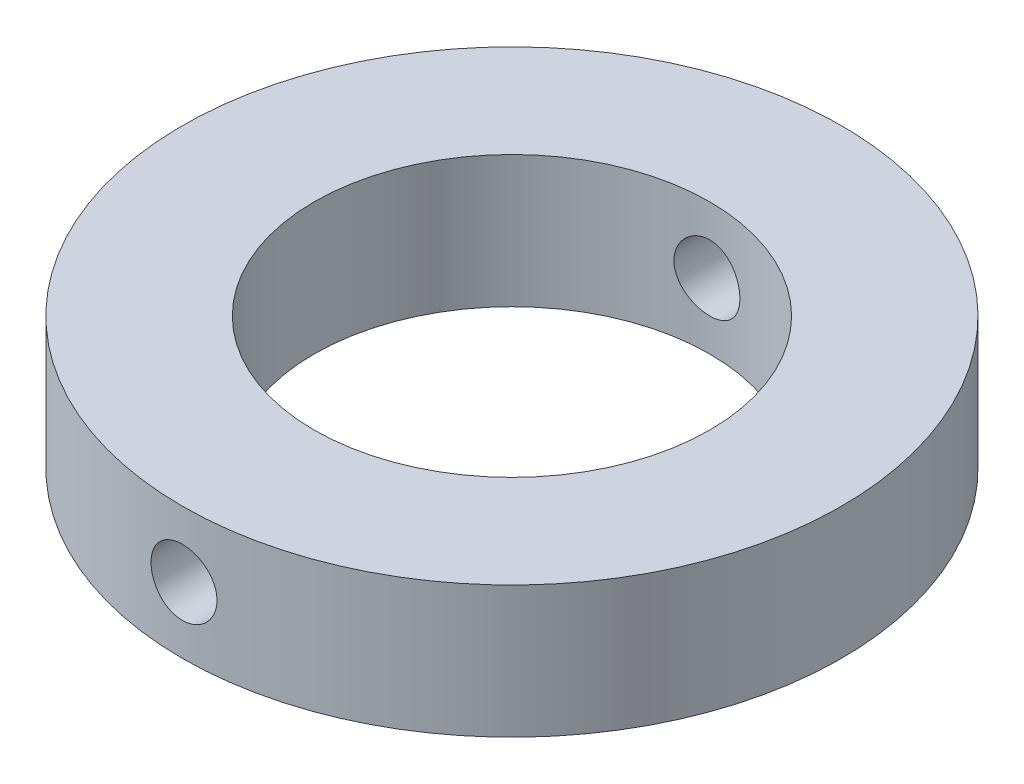
ISO-10303-21;
HEADER;
FILE_DESCRIPTION(('STEP AP214'),'2;1');
FILE_NAME('part.step','',(''),(''),'','','');
FILE_SCHEMA(('AUTOMOTIVE_DESIGN { 1 0 10303 214 1 1 1 1 }'));
ENDSEC;
DATA;
#1=APPLICATION_CONTEXT('core data for automotive mechanical design processes');
#2=APPLICATION_PROTOCOL_DEFINITION('international standard','automotive_design',2000,#1);
#3=PRODUCT_CONTEXT('',#1,'mechanical');
#4=PRODUCT('Part','Part','',(#3));
#5=PRODUCT_RELATED_PRODUCT_CATEGORY('part','',(#4));
#6=PRODUCT_DEFINITION_FORMATION('','',#4);
#7=PRODUCT_DEFINITION_CONTEXT('part definition',#1,'design');
#8=PRODUCT_DEFINITION('design','',#6,#7);
#9=PRODUCT_DEFINITION_SHAPE('','',#8);
#10=(LENGTH_UNIT() NAMED_UNIT(*) SI_UNIT(.MILLI.,.METRE.));
#11=(NAMED_UNIT(*) PLANE_ANGLE_UNIT() SI_UNIT($,.RADIAN.));
#12=(NAMED_UNIT(*) SI_UNIT($,.STERADIAN.) SOLID_ANGLE_UNIT());
#13=UNCERTAINTY_MEASURE_WITH_UNIT(LENGTH_MEASURE(1.E-05),#10,'distance_accuracy_value','');
#14=(GEOMETRIC_REPRESENTATION_CONTEXT(3) GLOBAL_UNCERTAINTY_ASSIGNED_CONTEXT((#13)) GLOBAL_UNIT_ASSIGNED_CONTEXT((#10,
#11,#12)) REPRESENTATION_CONTEXT('',''));
#15=CARTESIAN_POINT('',(0.,0.,0.));
#16=DIRECTION('',(0.,0.,1.));
#17=DIRECTION('',(1.,0.,0.));
#18=AXIS2_PLACEMENT_3D('',#15,#16,#17);
#19=CARTESIAN_POINT('',(0.,10.,0.));
#20=DIRECTION('',(0.,1.,0.));
#21=DIRECTION('',(0.,0.,1.));
#22=AXIS2_PLACEMENT_3D('',#19,#20,#21);
#23=PLANE('',#22);
#24=CARTESIAN_POINT('',(0.,10.,0.));
#25=DIRECTION('',(0.,1.,0.));
#26=DIRECTION('',(0.,0.,1.));
#27=AXIS2_PLACEMENT_3D('',#24,#25,#26);
#28=CIRCLE('',#27,25.);
#29=CARTESIAN_POINT('',(0.,10.,25.));
#30=VERTEX_POINT('',#29);
#31=EDGE_CURVE('E11',#30,#30,#28,.T.);
#32=ORIENTED_EDGE('',*,*,#31,.T.);
#33=EDGE_LOOP('',(#32));
#34=FACE_BOUND('',#33,.T.);
#35=CARTESIAN_POINT('',(0.,10.,0.));
#36=DIRECTION('',(0.,1.,0.));
#37=DIRECTION('',(0.,0.,1.));
#38=AXIS2_PLACEMENT_3D('',#35,#36,#37);
#39=CIRCLE('',#38,15.);
#40=CARTESIAN_POINT('',(0.,10.,15.));
#41=VERTEX_POINT('',#40);
#42=EDGE_CURVE('E60',#41,#41,#39,.T.);
#43=ORIENTED_EDGE('',*,*,#42,.F.);
#44=EDGE_LOOP('',(#43));
#45=FACE_BOUND('',#44,.T.);
#46=ADVANCED_FACE('F41',(#34,#45),#23,.T.);
#47=CARTESIAN_POINT('',(0.,0.,0.));
#48=DIRECTION('',(0.,1.,0.));
#49=DIRECTION('',(0.,0.,1.));
#50=AXIS2_PLACEMENT_3D('',#47,#48,#49);
#51=PLANE('',#50);
#52=CARTESIAN_POINT('',(0.,0.,0.));
#53=DIRECTION('',(0.,1.,0.));
#54=DIRECTION('',(0.,0.,1.));
#55=AXIS2_PLACEMENT_3D('',#52,#53,#54);
#56=CIRCLE('',#55,25.);
#57=CARTESIAN_POINT('',(0.,0.,25.));
#58=VERTEX_POINT('',#57);
#59=EDGE_CURVE('E55',#58,#58,#56,.T.);
#60=ORIENTED_EDGE('',*,*,#59,.F.);
#61=EDGE_LOOP('',(#60));
#62=FACE_BOUND('',#61,.T.);
#63=CARTESIAN_POINT('',(0.,0.,0.));
#64=DIRECTION('',(0.,1.,0.));
#65=DIRECTION('',(0.,0.,1.));
#66=AXIS2_PLACEMENT_3D('',#63,#64,#65);
#67=CIRCLE('',#66,15.);
#68=CARTESIAN_POINT('',(0.,0.,15.));
#69=VERTEX_POINT('',#68);
#70=EDGE_CURVE('E63',#69,#69,#67,.T.);
#71=ORIENTED_EDGE('',*,*,#70,.T.);
#72=EDGE_LOOP('',(#71));
#73=FACE_BOUND('',#72,.T.);
#74=ADVANCED_FACE('F99',(#62,#73),#51,.F.);
#75=CARTESIAN_POINT('',(0.,10.,0.));
#76=DIRECTION('',(0.,-1.,0.));
#77=DIRECTION('',(0.,0.,-1.));
#78=AXIS2_PLACEMENT_3D('',#75,#76,#77);
#79=CYLINDRICAL_SURFACE('',#78,25.);
#80=CARTESIAN_POINT('',(0.,7.5,-25.));
#81=CARTESIAN_POINT('',(-0.140050884478893,7.49999393524905,-24.9999983880192));
#82=CARTESIAN_POINT('',(-0.280194362919433,7.48819182775889,-24.9988106399051));
#83=CARTESIAN_POINT('',(-0.556595996242092,7.44128907427394,-24.9941866898684));
#84=CARTESIAN_POINT('',(-0.69284969792207,7.40616275993853,-24.9907480108506));
#85=CARTESIAN_POINT('',(-0.957429188633536,7.31364439850542,-24.9820103640768));
#86=CARTESIAN_POINT('',(-1.08575971153727,7.25626579870382,-24.9767125200177));
#87=CARTESIAN_POINT('',(-1.33094040240102,7.12089773017089,-24.9648489348577));
#88=CARTESIAN_POINT('',(-1.44779284694769,7.04291235999966,-24.9582834459533));
#89=CARTESIAN_POINT('',(-1.6671488766852,6.86824325584432,-24.9445936085331));
#90=CARTESIAN_POINT('',(-1.76960536208723,6.77150050149492,-24.9374675393466));
#91=CARTESIAN_POINT('',(-1.95685630357746,6.56218866434243,-24.9234739226566));
#92=CARTESIAN_POINT('',(-2.04164994270663,6.44961884989404,-24.9166063871229));
#93=CARTESIAN_POINT('',(-2.19133492610904,6.21155367079095,-24.9038897888196));
#94=CARTESIAN_POINT('',(-2.2561836636372,6.08603138976286,-24.8980429177726));
#95=CARTESIAN_POINT('',(-2.3638659618569,5.82581103523755,-24.8880509386631));
#96=CARTESIAN_POINT('',(-2.40670006647823,5.69111318854013,-24.8839057885556));
#97=CARTESIAN_POINT('',(-2.46899760400473,5.41684549783498,-24.8778021018244));
#98=CARTESIAN_POINT('',(-2.48853913250949,5.27729355786948,-24.8758362599524));
#99=CARTESIAN_POINT('',(-2.5039382128384,4.99687784151055,-24.8742910765131));
#100=CARTESIAN_POINT('',(-2.499796387177,4.85601409969485,-24.8747116722186));
#101=CARTESIAN_POINT('',(-2.4680107006317,4.57751172576671,-24.8778851724734));
#102=CARTESIAN_POINT('',(-2.44045211031138,4.43986325167827,-24.8806296147663));
#103=CARTESIAN_POINT('',(-2.36274786037646,4.17115509199727,-24.8881283571855));
#104=CARTESIAN_POINT('',(-2.31260189563937,4.04009549543742,-24.8928826844623));
#105=CARTESIAN_POINT('',(-2.19105223470377,3.78801603175278,-24.9038752363018));
#106=CARTESIAN_POINT('',(-2.11961070679995,3.66701452627671,-24.9101160977039));
#107=CARTESIAN_POINT('',(-1.95752506838307,3.4386869627203,-24.923376293322));
#108=CARTESIAN_POINT('',(-1.86688039584126,3.33136130504559,-24.9303956503196));
#109=CARTESIAN_POINT('',(-1.66848528103017,3.13293651502744,-24.9444596328247));
#110=CARTESIAN_POINT('',(-1.56066119712841,3.04191099529799,-24.9515042333249));
#111=CARTESIAN_POINT('',(-1.33122370434278,2.87924091772403,-24.964795726963));
#112=CARTESIAN_POINT('',(-1.209610279999,2.80759638160881,-24.9710426192064));
#113=CARTESIAN_POINT('',(-0.955995264230911,2.68572494922437,-24.9820368916774));
#114=CARTESIAN_POINT('',(-0.823991865974757,2.63550178795485,-24.9867840103692));
#115=CARTESIAN_POINT('',(-0.553368043324829,2.55795270822062,-24.9942411860352));
#116=CARTESIAN_POINT('',(-0.4147478169415,2.53062610502345,-24.9969513039266));
#117=CARTESIAN_POINT('',(-0.135462747729758,2.49973923066309,-25.0000212917078));
#118=CARTESIAN_POINT('',(0.00519075526373111,2.49607737936876,-25.0003912066934));
#119=CARTESIAN_POINT('',(0.28510948328925,2.51235715762191,-24.9987660439199));
#120=CARTESIAN_POINT('',(0.424374727051176,2.5322984682882,-24.9967709981117));
#121=CARTESIAN_POINT('',(0.697270517086688,2.59513423855394,-24.9906465384799));
#122=CARTESIAN_POINT('',(0.83091212243005,2.63798113619503,-24.986521547951));
#123=CARTESIAN_POINT('',(1.08911080345946,2.74536293509318,-24.9765999715152));
#124=CARTESIAN_POINT('',(1.21366767539279,2.8098983225985,-24.9708033481313));
#125=CARTESIAN_POINT('',(1.45062045043036,2.95907709665979,-24.9581618832606));
#126=CARTESIAN_POINT('',(1.56297414937229,3.04378722231455,-24.951313590086));
#127=CARTESIAN_POINT('',(1.7719040582797,3.23081516935232,-24.937348321738));
#128=CARTESIAN_POINT('',(1.86847987212294,3.3331334326758,-24.9302313398243));
#129=CARTESIAN_POINT('',(2.04346527471786,3.55291643664751,-24.9165006035189));
#130=CARTESIAN_POINT('',(2.12180819669886,3.67043439135656,-24.9098887534744));
#131=CARTESIAN_POINT('',(2.25764564685957,3.91701840036672,-24.8979458115222));
#132=CARTESIAN_POINT('',(2.31514046013471,4.04608429672099,-24.8926147021009));
#133=CARTESIAN_POINT('',(2.40753802171119,4.31187184866449,-24.8838486908512));
#134=CARTESIAN_POINT('',(2.44248043702965,4.44857960022781,-24.8804104612447));
#135=CARTESIAN_POINT('',(2.48891001782366,4.72595799490193,-24.8758091320719));
#136=CARTESIAN_POINT('',(2.50039785599879,4.86662852423919,-24.8746459672547));
#137=CARTESIAN_POINT('',(2.49958284617814,5.14727672089177,-24.8747278276891));
#138=CARTESIAN_POINT('',(2.48738472398278,5.28725470720704,-24.8759622521752));
#139=CARTESIAN_POINT('',(2.43976363240913,5.56316229292072,-24.8806775972386));
#140=CARTESIAN_POINT('',(2.4043406369054,5.69909188776495,-24.884158520343));
#141=CARTESIAN_POINT('',(2.31130421574376,5.96304337261965,-24.8929717065797));
#142=CARTESIAN_POINT('',(2.25369386085229,6.09106635407432,-24.898303713509));
#143=CARTESIAN_POINT('',(2.11792888727761,6.33564222917759,-24.910218795984));
#144=CARTESIAN_POINT('',(2.03977438363854,6.45219518705158,-24.9168018645238));
#145=CARTESIAN_POINT('',(1.86474639071333,6.67105918617984,-24.9305121802424));
#146=CARTESIAN_POINT('',(1.76779487222567,6.77330769091772,-24.9376416181688));
#147=CARTESIAN_POINT('',(1.55807924806277,6.96013058174915,-24.9516213682196));
#148=CARTESIAN_POINT('',(1.44531136027064,7.04470072839293,-24.9584716130744));
#149=CARTESIAN_POINT('',(1.20685358540322,7.19393363463656,-24.971139051729));
#150=CARTESIAN_POINT('',(1.08113187336691,7.25854572736296,-24.9769536006703));
#151=CARTESIAN_POINT('',(0.820645697751377,7.36565605705967,-24.9868657312474));
#152=CARTESIAN_POINT('',(0.685891624564024,7.40817922738387,-24.9909652477413));
#153=CARTESIAN_POINT('',(0.458645653514261,7.45930154271201,-24.9959553443433));
#154=CARTESIAN_POINT('',(0.367606382111273,7.4745426107484,-24.9974650172958));
#155=CARTESIAN_POINT('',(0.184391452043283,7.49489381515441,-24.9994878737697));
#156=CARTESIAN_POINT('',(0.0922157980663949,7.50000399330466,-25.0000010614006));
#157=CARTESIAN_POINT('',(0.,7.5,-25.));
#158=B_SPLINE_CURVE_WITH_KNOTS('',3,(#80,#81,#82,#83,#84,#85,#86,#87,#88,#89,#90,#91,#92,#93,
#94,#95,#96,#97,#98,#99,#100,#101,#102,#103,#104,#105,#106,#107,#108,#109,#110,#111,#112,#113,
#114,#115,#116,#117,#118,#119,#120,#121,#122,#123,#124,#125,#126,#127,#128,#129,#130,#131,#132,
#133,#134,#135,#136,#137,#138,#139,#140,#141,#142,#143,#144,#145,#146,#147,#148,#149,#150,#151,
#152,#153,#154,#155,#156,#157),.UNSPECIFIED.,.T.,.F.,(4,2,2,2,2,2,2,2,2,2,2,2,2,2,2,2,2,2,2,2,2,
2,2,2,2,2,2,2,2,2,2,2,2,2,2,2,2,2,4),(0.,0.419815915671184,0.840094607088716,1.26011971433051,
1.68006134395696,2.10134642155736,2.52265098051765,2.94484938680555,3.3670373610626,
3.78780580112992,4.20856318139441,4.62779493602776,5.04703235404084,5.46701903432237,
5.88701800827813,6.30886835490516,6.73071917449429,7.15264351733954,7.57455524188599,
7.99465471519394,8.41474851297859,8.83397338235762,9.25320765123667,9.67384851871746,
10.0944999452558,10.516666090215,10.9388264618844,11.3602422648251,11.7816459809896,
12.2011907323489,12.620735955651,13.04022313407,13.459707963474,13.8809729356913,
14.3023388159239,14.7247657756561,15.1467148698824,15.4231416808087,15.6995673517257),.UNSPECIFIED.);
#159=CARTESIAN_POINT('',(0.,7.5,-25.));
#160=VERTEX_POINT('',#159);
#161=EDGE_CURVE('E88',#160,#160,#158,.T.);
#162=ORIENTED_EDGE('',*,*,#161,.T.);
#163=EDGE_LOOP('',(#162));
#164=FACE_BOUND('',#163,.T.);
#165=CARTESIAN_POINT('',(2.5,5.,24.8746859276655));
#166=CARTESIAN_POINT('',(2.49999393348378,4.859951089566,24.8746875699226));
#167=CARTESIAN_POINT('',(2.48819214745619,4.7198095789704,24.8758814248555));
#168=CARTESIAN_POINT('',(2.44129078690891,4.44341203426616,24.880527188953));
#169=CARTESIAN_POINT('',(2.40616553721609,4.30716045490628,24.8839815865305));
#170=CARTESIAN_POINT('',(2.31365029017232,4.04258545195524,24.8927533261847));
#171=CARTESIAN_POINT('',(2.25627379073475,3.9142572765214,24.8980695386697));
#172=CARTESIAN_POINT('',(2.12091066847775,3.66908051927063,24.9099645142955));
#173=CARTESIAN_POINT('',(2.04292813906481,3.55222966379071,24.9165430266082));
#174=CARTESIAN_POINT('',(1.86826190499676,3.33287184085626,24.9302481677475));
#175=CARTESIAN_POINT('',(1.77151854527065,3.23041247624055,24.9373765001317));
#176=CARTESIAN_POINT('',(1.56220428829891,3.04315597749108,24.951362630893));
#177=CARTESIAN_POINT('',(1.44963266726642,2.95835965148423,24.9582204168803));
#178=CARTESIAN_POINT('',(1.21156590412747,2.80867185748212,24.9709095788901));
#179=CARTESIAN_POINT('',(1.08604415632392,2.74382250301584,24.9767387723662));
#180=CARTESIAN_POINT('',(0.825824960718776,2.6361389171283,24.9866954218943));
#181=CARTESIAN_POINT('',(0.691127736670547,2.59330414907633,24.9908229194266));
#182=CARTESIAN_POINT('',(0.416861956857374,2.53100522661688,24.9968991642756));
#183=CARTESIAN_POINT('',(0.277311317578954,2.51146291812514,24.9988551960704));
#184=CARTESIAN_POINT('',(-0.0031018517223572,2.49606182716571,25.0003928899673));
#185=CARTESIAN_POINT('',(-0.143964347636153,2.50020243063432,24.9999746136318));
#186=CARTESIAN_POINT('',(-0.4224721101614,2.53198618162539,24.9968167827796));
#187=CARTESIAN_POINT('',(-0.560127074837447,2.55954528890973,24.9940855287928));
#188=CARTESIAN_POINT('',(-0.828847948761332,2.63725282236656,24.9866182316233));
#189=CARTESIAN_POINT('',(-0.959913772394321,2.68740154196893,24.9818821623988));
#190=CARTESIAN_POINT('',(-1.21200078669897,2.8089569081361,24.9709234370979));
#191=CARTESIAN_POINT('',(-1.33300392745412,2.8804007438254,24.9646981841439));
#192=CARTESIAN_POINT('',(-1.56133378293548,3.04249130834093,24.9514596129852));
#193=CARTESIAN_POINT('',(-1.66866009640207,3.13313860036296,24.9444462716703));
#194=CARTESIAN_POINT('',(-1.86708192955672,3.33153557378412,24.9303823366963));
#195=CARTESIAN_POINT('',(-1.95810436547586,3.43935836185394,24.9233317143257));
#196=CARTESIAN_POINT('',(-2.12076883839479,3.66879216302695,24.9100184982056));
#197=CARTESIAN_POINT('',(-2.19241084728222,3.79040319613036,24.9037559055991));
#198=CARTESIAN_POINT('',(-2.31428046143307,4.04401756299948,24.8927272378537));
#199=CARTESIAN_POINT('',(-2.3645035514324,4.17602308105722,24.8879614783139));
#200=CARTESIAN_POINT('',(-2.44205183909397,4.44665151153673,24.8804725467734));
#201=CARTESIAN_POINT('',(-2.46937773435758,4.58527422221861,24.8777493125442));
#202=CARTESIAN_POINT('',(-2.5002619384799,4.86456044882377,24.8746645131854));
#203=CARTESIAN_POINT('',(-2.50392249161803,5.00521255066209,24.8742927886901));
#204=CARTESIAN_POINT('',(-2.48764061717841,5.28512816455716,24.8759262838693));
#205=CARTESIAN_POINT('',(-2.46769850852438,5.42439169535092,24.8779314714265));
#206=CARTESIAN_POINT('',(-2.4048629362688,5.69727895569586,24.88408361056));
#207=CARTESIAN_POINT('',(-2.36201781797227,5.83091392773665,24.8882260500336));
#208=CARTESIAN_POINT('',(-2.25464179918985,6.08910012932577,24.8981822759699));
#209=CARTESIAN_POINT('',(-2.19011040195897,6.21365115071796,24.9039961007167));
#210=CARTESIAN_POINT('',(-2.04093750355804,6.45059993507194,24.9166646088928));
#211=CARTESIAN_POINT('',(-1.95622824960173,6.56295485491564,24.9235227703668));
#212=CARTESIAN_POINT('',(-1.76920133362793,6.77188763318517,24.9374958156297));
#213=CARTESIAN_POINT('',(-1.66688323562034,6.8684651008502,24.9446107057716));
#214=CARTESIAN_POINT('',(-1.44709951056618,7.04345408349524,24.9583261962325));
#215=CARTESIAN_POINT('',(-1.32958063992363,7.12179889896555,24.9649248513869));
#216=CARTESIAN_POINT('',(-1.08299429354283,7.25763967126603,24.9768360526658));
#217=CARTESIAN_POINT('',(-0.953926976074063,7.31513591376777,24.9821486164123));
#218=CARTESIAN_POINT('',(-0.688140316082037,7.40753441913834,24.9908802603501));
#219=CARTESIAN_POINT('',(-0.551435094124898,7.44247696831304,24.9943027151412));
#220=CARTESIAN_POINT('',(-0.274062034959197,7.48890767394961,24.9988823653412));
#221=CARTESIAN_POINT('',(-0.133394309230543,7.5003964895851,25.0000396244141));
#222=CARTESIAN_POINT('',(0.147255560189367,7.49958433390015,24.9999584578317));
#223=CARTESIAN_POINT('',(0.287238018061321,7.48738690790836,24.9987304594167));
#224=CARTESIAN_POINT('',(0.563154720890908,7.43976563585756,24.9940373394398));
#225=CARTESIAN_POINT('',(0.699088962670915,7.40434177156758,24.9905722161218));
#226=CARTESIAN_POINT('',(0.963049771919359,7.31130185651767,24.981793095349));
#227=CARTESIAN_POINT('',(1.09107741519382,7.25368883266461,24.9764793500812));
#228=CARTESIAN_POINT('',(1.33566150038699,7.11791707770756,24.9645953104074));
#229=CARTESIAN_POINT('',(1.4522180094214,7.03975846682221,24.9580250233539));
#230=CARTESIAN_POINT('',(1.67108181106735,6.86472595244063,24.9443296167264));
#231=CARTESIAN_POINT('',(1.77332731554835,6.767774959388,24.9372022865175));
#232=CARTESIAN_POINT('',(1.96014439848286,6.55806162113638,24.9232147692415));
#233=CARTESIAN_POINT('',(2.04471172961962,6.44529548707731,24.9163546466944));
#234=CARTESIAN_POINT('',(2.19394160106013,6.20683914520023,24.903659585265));
#235=CARTESIAN_POINT('',(2.25855296998709,6.08111679668987,24.8978272981327));
#236=CARTESIAN_POINT('',(2.36566177024692,5.82062927188442,24.8878798690615));
#237=CARTESIAN_POINT('',(2.40818414472465,5.68587449018572,24.883762791334));
#238=CARTESIAN_POINT('',(2.45930422083382,5.45863064775222,24.8787501884536));
#239=CARTESIAN_POINT('',(2.47454428099556,5.36759437173393,24.8772332983924));
#240=CARTESIAN_POINT('',(2.49489414651278,5.18438544239362,24.8752006294416));
#241=CARTESIAN_POINT('',(2.50000399439316,5.09221279384352,24.8746848463496));
#242=CARTESIAN_POINT('',(2.5,5.,24.8746859276655));
#243=B_SPLINE_CURVE_WITH_KNOTS('',3,(#165,#166,#167,#168,#169,#170,#171,#172,#173,#174,#175,
#176,#177,#178,#179,#180,#181,#182,#183,#184,#185,#186,#187,#188,#189,#190,#191,#192,#193,#194,
#195,#196,#197,#198,#199,#200,#201,#202,#203,#204,#205,#206,#207,#208,#209,#210,#211,#212,#213,
#214,#215,#216,#217,#218,#219,#220,#221,#222,#223,#224,#225,#226,#227,#228,#229,#230,#231,#232,
#233,#234,#235,#236,#237,#238,#239,#240,#241,#242),.UNSPECIFIED.,.T.,.F.,(4,2,2,2,2,2,2,2,2,2,2,
2,2,2,2,2,2,2,2,2,2,2,2,2,2,2,2,2,2,2,2,2,2,2,2,2,2,2,4),(0.,0.419809986091155,
0.840082879554424,1.26010122749369,1.68003620105329,2.10132903824813,2.52264114638132,
2.94483674928229,3.36702206019487,3.78778677246124,4.20854057495581,4.62779079546654,
5.04704646202436,5.46703863666033,5.88704313046322,6.30888562712503,6.73072873568907,
7.15266072794834,7.57457986487582,7.99467490769413,8.41476427417175,8.83397036761317,
9.25318606402618,9.67382974529295,10.0944838430801,10.516653420453,10.9388172129501,
11.360224817359,11.7816205778287,12.2011783367121,12.6207364249165,13.0402372998812,
13.45973572027,13.8809928759497,14.3023511258631,14.7247810267619,15.14673287235,
15.4231506901512,15.6995673475954),.UNSPECIFIED.);
#244=CARTESIAN_POINT('',(2.5,5.,24.8746859276655));
#245=VERTEX_POINT('',#244);
#246=EDGE_CURVE('E83',#245,#245,#243,.T.);
#247=ORIENTED_EDGE('',*,*,#246,.T.);
#248=EDGE_LOOP('',(#247));
#249=FACE_BOUND('',#248,.T.);
#250=ORIENTED_EDGE('',*,*,#31,.F.);
#251=EDGE_LOOP('',(#250));
#252=FACE_BOUND('',#251,.T.);
#253=ORIENTED_EDGE('',*,*,#59,.T.);
#254=EDGE_LOOP('',(#253));
#255=FACE_BOUND('',#254,.T.);
#256=ADVANCED_FACE('F43',(#164,#249,#252,#255),#79,.T.);
#257=CARTESIAN_POINT('',(0.,10.,0.));
#258=DIRECTION('',(0.,-1.,0.));
#259=DIRECTION('',(0.,0.,-1.));
#260=AXIS2_PLACEMENT_3D('',#257,#258,#259);
#261=CYLINDRICAL_SURFACE('',#260,15.);
#262=CARTESIAN_POINT('',(0.,7.5,-15.));
#263=CARTESIAN_POINT('',(-0.139390904958215,7.49999441105219,-14.9999976116882));
#264=CARTESIAN_POINT('',(-0.278857881838821,7.48830272503108,-14.9980367791303));
#265=CARTESIAN_POINT('',(-0.553880221673043,7.44186434123468,-14.9904034494139));
#266=CARTESIAN_POINT('',(-0.689431867959247,7.4070964430884,-14.9847275392389));
#267=CARTESIAN_POINT('',(-0.952604747212644,7.31558455140725,-14.9703006823645));
#268=CARTESIAN_POINT('',(-1.0802323684319,7.25885853435943,-14.9615522515919));
#269=CARTESIAN_POINT('',(-1.32414184197794,7.12508770794761,-14.9419422708207));
#270=CARTESIAN_POINT('',(-1.44042498987859,7.04804522251701,-14.9310809625443));
#271=CARTESIAN_POINT('',(-1.65947261429168,6.87504491617954,-14.9083331745831));
#272=CARTESIAN_POINT('',(-1.76211290353497,6.77893088536387,-14.8964387181486));
#273=CARTESIAN_POINT('',(-1.94988849865993,6.57085203152719,-14.8730262687673));
#274=CARTESIAN_POINT('',(-2.03502269939097,6.45888620854339,-14.8615082996267));
#275=CARTESIAN_POINT('',(-2.18586712560513,6.22142903380295,-14.8400756575978));
#276=CARTESIAN_POINT('',(-2.251454552861,6.09585866319525,-14.8301712909164));
#277=CARTESIAN_POINT('',(-2.36055836541122,5.83529043569938,-14.8131978979467));
#278=CARTESIAN_POINT('',(-2.40407624156561,5.70029321632237,-14.8061286801431));
#279=CARTESIAN_POINT('',(-2.46741437778481,5.42601972514346,-14.7957053684276));
#280=CARTESIAN_POINT('',(-2.4874490291354,5.28679426349861,-14.792317684857));
#281=CARTESIAN_POINT('',(-2.50391672528988,5.00691972311653,-14.7895393893665));
#282=CARTESIAN_POINT('',(-2.500351440389,4.8662707458327,-14.7901484945721));
#283=CARTESIAN_POINT('',(-2.46989509839615,4.58907213872456,-14.7952642886356));
#284=CARTESIAN_POINT('',(-2.44324488188977,4.45249519645477,-14.7997307331892));
#285=CARTESIAN_POINT('',(-2.36775314040344,4.18577868217087,-14.8119949521101));
#286=CARTESIAN_POINT('',(-2.31891085431974,4.05563933111146,-14.8197928407327));
#287=CARTESIAN_POINT('',(-2.20017724609391,3.80477117655908,-14.837884793341));
#288=CARTESIAN_POINT('',(-2.13018591387971,3.68409059391878,-14.8481906710733));
#289=CARTESIAN_POINT('',(-1.97121201755743,3.45609559946162,-14.8701291841501));
#290=CARTESIAN_POINT('',(-1.88222792065429,3.34878226754507,-14.8817619265429));
#291=CARTESIAN_POINT('',(-1.68648221215905,3.14917391419266,-14.9052202787979));
#292=CARTESIAN_POINT('',(-1.57951396387313,3.05708148145992,-14.9170464923165));
#293=CARTESIAN_POINT('',(-1.35153524898165,2.89212223733466,-14.9394260139672));
#294=CARTESIAN_POINT('',(-1.23052469190642,2.81925554981678,-14.9499793138975));
#295=CARTESIAN_POINT('',(-0.977705916166709,2.69479777286372,-14.9686389289291));
#296=CARTESIAN_POINT('',(-0.845888725564659,2.64322458066875,-14.9767431840745));
#297=CARTESIAN_POINT('',(-0.575298345602729,2.56300578475402,-14.9895750301266));
#298=CARTESIAN_POINT('',(-0.436525739179466,2.53435826302629,-14.9943029035047));
#299=CARTESIAN_POINT('',(-0.157709901301622,2.50107864153887,-14.9998112984269));
#300=CARTESIAN_POINT('',(-0.0177007371510094,2.4961684281944,-15.0006375301278));
#301=CARTESIAN_POINT('',(0.261139772889889,2.50976134442813,-14.9983747442117));
#302=CARTESIAN_POINT('',(0.399971163892041,2.52826357313374,-14.9952858772412));
#303=CARTESIAN_POINT('',(0.671656175546766,2.58792484933548,-14.985568269382));
#304=CARTESIAN_POINT('',(0.804540868385381,2.62894620839013,-14.9789610480131));
#305=CARTESIAN_POINT('',(1.06154688486044,2.73233451819954,-14.9629446445536));
#306=CARTESIAN_POINT('',(1.18566771590972,2.79470266763528,-14.9535353051202));
#307=CARTESIAN_POINT('',(1.42283068946896,2.93965112469679,-14.9328451630241));
#308=CARTESIAN_POINT('',(1.53576525093715,3.02240515616726,-14.9215485588702));
#309=CARTESIAN_POINT('',(1.74624358550269,3.20553731538506,-14.898384673919));
#310=CARTESIAN_POINT('',(1.84378623969658,3.30591672327667,-14.8865173517155));
#311=CARTESIAN_POINT('',(2.021742779658,3.52269754807143,-14.8634017523585));
#312=CARTESIAN_POINT('',(2.10196876111372,3.63925416551441,-14.8521611613711));
#313=CARTESIAN_POINT('',(2.24170231029499,3.88435296913854,-14.8317152977788));
#314=CARTESIAN_POINT('',(2.30121053476982,4.0128947752275,-14.8225099606602));
#315=CARTESIAN_POINT('',(2.39753833147315,4.27778973281214,-14.807234536977));
#316=CARTESIAN_POINT('',(2.43445143254795,4.41410809503049,-14.8011515431106));
#317=CARTESIAN_POINT('',(2.48483545377828,4.69112012922177,-14.7927771683526));
#318=CARTESIAN_POINT('',(2.49830841194617,4.83181341973206,-14.7904854578272));
#319=CARTESIAN_POINT('',(2.50137286604735,5.11170516596241,-14.7899673308401));
#320=CARTESIAN_POINT('',(2.49126013612519,5.25090037857529,-14.7916905650565));
#321=CARTESIAN_POINT('',(2.44807983895685,5.52557924805077,-14.7988978145373));
#322=CARTESIAN_POINT('',(2.41501234611248,5.66106291694188,-14.8043818176121));
#323=CARTESIAN_POINT('',(2.3269744895949,5.92435843729262,-14.8184735628172));
#324=CARTESIAN_POINT('',(2.27202959060044,6.05217901005603,-14.8270776721967));
#325=CARTESIAN_POINT('',(2.14182700391591,6.29683566919485,-14.8464436892221));
#326=CARTESIAN_POINT('',(2.06656830874856,6.41367121037214,-14.857205703884));
#327=CARTESIAN_POINT('',(1.89681888437216,6.63453558310776,-14.8798345404562));
#328=CARTESIAN_POINT('',(1.80211056359365,6.73839601670028,-14.891712955763));
#329=CARTESIAN_POINT('',(1.59660903138023,6.92885160447494,-14.9151437236084));
#330=CARTESIAN_POINT('',(1.48581211291264,7.01544276863818,-14.9266960002655));
#331=CARTESIAN_POINT('',(1.25036916964028,7.16944826819995,-14.9482652964222));
#332=CARTESIAN_POINT('',(1.12563278753282,7.23672603931296,-14.958271162531));
#333=CARTESIAN_POINT('',(0.866513069378981,7.34926948460992,-14.9755116760178));
#334=CARTESIAN_POINT('',(0.73213949483001,7.3945570810797,-14.9827490817748));
#335=CARTESIAN_POINT('',(0.497703310045401,7.45200527412667,-14.9920579083296));
#336=CARTESIAN_POINT('',(0.399058830298447,7.46997446961597,-14.9950202727336));
#337=CARTESIAN_POINT('',(0.200289310319809,7.49397373784476,-14.9989921598612));
#338=CARTESIAN_POINT('',(0.100164295608494,7.50000401613737,-15.0000017162064));
#339=CARTESIAN_POINT('',(0.,7.5,-15.));
#340=B_SPLINE_CURVE_WITH_KNOTS('',3,(#262,#263,#264,#265,#266,#267,#268,#269,#270,#271,#272,
#273,#274,#275,#276,#277,#278,#279,#280,#281,#282,#283,#284,#285,#286,#287,#288,#289,#290,#291,
#292,#293,#294,#295,#296,#297,#298,#299,#300,#301,#302,#303,#304,#305,#306,#307,#308,#309,#310,
#311,#312,#313,#314,#315,#316,#317,#318,#319,#320,#321,#322,#323,#324,#325,#326,#327,#328,#329,
#330,#331,#332,#333,#334,#335,#336,#337,#338,#339),.UNSPECIFIED.,.T.,.F.,(4,2,2,2,2,2,2,2,2,2,2,
2,2,2,2,2,2,2,2,2,2,2,2,2,2,2,2,2,2,2,2,2,2,2,2,2,2,2,4),(0.,0.41780658493851,0.835997545695421,
1.25384686702527,1.67164841267479,2.09302491062332,2.51442800169857,2.9384252082384,
3.36239376876181,3.78246077103424,4.20249804320887,4.61820521760409,5.03392665025381,
5.45164556632558,5.86939820680574,6.29232769911327,6.71525991635848,7.13854688915904,
7.56179844521149,7.98007883491397,8.3983431303586,8.81407807006416,9.22983635826067,
9.64926825627024,10.0687306305428,10.4925382200762,10.9163323737594,11.3383602234177,
11.7603513778662,12.177079095227,12.5938054618813,13.0100481822622,13.4263115502934,
13.8475138419339,14.2688133387897,14.693022316072,15.1168075213007,15.4170424816402,
15.7172722727697),.UNSPECIFIED.);
#341=CARTESIAN_POINT('',(0.,7.5,-15.));
#342=VERTEX_POINT('',#341);
#343=EDGE_CURVE('E46',#342,#342,#340,.T.);
#344=ORIENTED_EDGE('',*,*,#343,.F.);
#345=EDGE_LOOP('',(#344));
#346=FACE_BOUND('',#345,.T.);
#347=CARTESIAN_POINT('',(2.5,5.,14.790199457749));
#348=CARTESIAN_POINT('',(2.49999439841983,4.86062425183819,14.790201973666));
#349=CARTESIAN_POINT('',(2.48830516902828,4.72117239392853,14.7921909238523));
#350=CARTESIAN_POINT('',(2.44187742806638,4.44618145673683,14.7999245720004));
#351=CARTESIAN_POINT('',(2.40711766030861,4.31064610624194,14.8056727334637));
#352=CARTESIAN_POINT('',(2.31562954367049,4.0475077166584,14.8202560936731));
#353=CARTESIAN_POINT('',(2.25891955493199,3.91989815133776,14.8290887118401));
#354=CARTESIAN_POINT('',(2.12518649688947,3.67601904528223,14.8488427210228));
#355=CARTESIAN_POINT('',(2.04816571350133,3.55974823042267,14.8597638769423));
#356=CARTESIAN_POINT('',(1.87518752696654,3.34068715025544,14.8825847115588));
#357=CARTESIAN_POINT('',(1.77906904893234,3.23802486861379,14.8944921732795));
#358=CARTESIAN_POINT('',(1.57097200469527,3.05020669313819,14.9178748066858));
#359=CARTESIAN_POINT('',(1.45899249914997,2.96505183688459,14.9293499527174));
#360=CARTESIAN_POINT('',(1.22152286994836,2.81418543278073,14.9506573698271));
#361=CARTESIAN_POINT('',(1.09595608145671,2.7485929922682,14.9604794243234));
#362=CARTESIAN_POINT('',(0.835395621723867,2.63947892946945,14.9772873695709));
#363=CARTESIAN_POINT('',(0.700402564078187,2.59595587211513,14.9842734447266));
#364=CARTESIAN_POINT('',(0.426143726344241,2.5326074650161,14.994567347244));
#365=CARTESIAN_POINT('',(0.28692888667927,2.51256708399531,14.9979085311091));
#366=CARTESIAN_POINT('',(0.00707528552579579,2.49608424584741,15.0006507934278));
#367=CARTESIAN_POINT('',(-0.1335633785289,2.49964018475277,15.0000521396931));
#368=CARTESIAN_POINT('',(-0.410802185078877,2.53008135152821,14.9950085843139));
#369=CARTESIAN_POINT('',(-0.547428530700142,2.55673516340916,14.990601836924));
#370=CARTESIAN_POINT('',(-0.814241979611793,2.6322510742465,14.9784797877164));
#371=CARTESIAN_POINT('',(-0.944428886651505,2.6811138495895,14.9707643851321));
#372=CARTESIAN_POINT('',(-1.19535614778265,2.79989064031532,14.9528269851196));
#373=CARTESIAN_POINT('',(-1.31605052301905,2.86990001208244,14.9425936732688));
#374=CARTESIAN_POINT('',(-1.54406552984664,3.02891282263505,14.920757380715));
#375=CARTESIAN_POINT('',(-1.65138507791588,3.11791779871082,14.9091542891913));
#376=CARTESIAN_POINT('',(-1.85097127344667,3.31367880661931,14.885702682326));
#377=CARTESIAN_POINT('',(-1.94303950225321,3.42063709490099,14.8738528973104));
#378=CARTESIAN_POINT('',(-2.10795458844806,3.64858709021582,14.8513795978481));
#379=CARTESIAN_POINT('',(-2.18080126853242,3.76957892668282,14.8407560947132));
#380=CARTESIAN_POINT('',(-2.30524443448829,4.02239164187748,14.8219375456182));
#381=CARTESIAN_POINT('',(-2.35681702727924,4.15422449809209,14.813745233026));
#382=CARTESIAN_POINT('',(-2.43702987081562,4.42484907230755,14.8007618868988));
#383=CARTESIAN_POINT('',(-2.46567214076796,4.56364017643243,14.7959705538832));
#384=CARTESIAN_POINT('',(-2.49893188487927,4.84246615616214,14.7903895942212));
#385=CARTESIAN_POINT('',(-2.50383220791244,4.98246637970211,14.7895528575867));
#386=CARTESIAN_POINT('',(-2.49022270268246,5.26128667169082,14.7918503478236));
#387=CARTESIAN_POINT('',(-2.47171377862467,5.40010678551398,14.7949844213185));
#388=CARTESIAN_POINT('',(-2.4120523349281,5.67172775919086,14.8048268745502));
#389=CARTESIAN_POINT('',(-2.37104379064639,5.80456113987802,14.8115125191835));
#390=CARTESIAN_POINT('',(-2.26769819019228,6.06147016627949,14.827685730055));
#391=CARTESIAN_POINT('',(-2.20535985810093,6.18554528755091,14.8371734639058));
#392=CARTESIAN_POINT('',(-2.06045667322923,6.42267459440611,14.8579912839739));
#393=CARTESIAN_POINT('',(-1.97771056415936,6.53561657275606,14.8693375560035));
#394=CARTESIAN_POINT('',(-1.79458946570798,6.74611353269501,14.8925466667987));
#395=CARTESIAN_POINT('',(-1.69421323638404,6.84366743110974,14.9044095418533));
#396=CARTESIAN_POINT('',(-1.47742807032881,7.02165189272871,14.9274642211826));
#397=CARTESIAN_POINT('',(-1.36086325338619,7.10189382628455,14.9386477634467));
#398=CARTESIAN_POINT('',(-1.11574344794932,7.24165532700489,14.9589511243294));
#399=CARTESIAN_POINT('',(-0.987188847470624,7.30117556447385,14.9680710096998));
#400=CARTESIAN_POINT('',(-0.722299051501326,7.39751058395487,14.9831835816958));
#401=CARTESIAN_POINT('',(-0.58600056260261,7.43442407573492,14.9891898456762));
#402=CARTESIAN_POINT('',(-0.30903073487421,7.48481559896383,14.9974558316928));
#403=CARTESIAN_POINT('',(-0.168359756821618,7.49829555873236,14.9997158620019));
#404=CARTESIAN_POINT('',(0.111541275773678,7.5013818823122,15.0002303788781));
#405=CARTESIAN_POINT('',(0.250768160602666,7.49127525394109,14.9985330202419));
#406=CARTESIAN_POINT('',(0.525511974314707,7.44809607773058,14.9914217838733));
#407=CARTESIAN_POINT('',(0.661028923967481,7.41502365849033,14.9860079269518));
#408=CARTESIAN_POINT('',(0.92439644591854,7.32696183445635,14.972069888274));
#409=CARTESIAN_POINT('',(1.05225537215382,7.27199683178995,14.9635491704088));
#410=CARTESIAN_POINT('',(1.29698045298217,7.14174206376942,14.9443275687803));
#411=CARTESIAN_POINT('',(1.41384608611822,7.06645133493755,14.9336265816741));
#412=CARTESIAN_POINT('',(1.6347129455264,6.8966649075395,14.9110762961641));
#413=CARTESIAN_POINT('',(1.73855143060275,6.80195904524875,14.8992152454112));
#414=CARTESIAN_POINT('',(1.92896387595091,6.59647169209619,14.8757630331437));
#415=CARTESIAN_POINT('',(2.0155337867119,6.48568644108747,14.8641719354951));
#416=CARTESIAN_POINT('',(2.16951427091086,6.25025467751039,14.8424834353391));
#417=CARTESIAN_POINT('',(2.2367849890577,6.12551566023452,14.8323971784578));
#418=CARTESIAN_POINT('',(2.34931453640427,5.86639076416186,14.8149921009131));
#419=CARTESIAN_POINT('',(2.39459535522307,5.73201467732264,14.8076705172488));
#420=CARTESIAN_POINT('',(2.45202605312742,5.49759623051262,14.7982474485649));
#421=CARTESIAN_POINT('',(2.46998741767139,5.3989731920374,14.7952462341947));
#422=CARTESIAN_POINT('',(2.49397629518131,5.20024651516307,14.7912213528807));
#423=CARTESIAN_POINT('',(2.50000402479277,5.1001429036758,14.7901976500369));
#424=CARTESIAN_POINT('',(2.5,5.,14.790199457749));
#425=B_SPLINE_CURVE_WITH_KNOTS('',3,(#347,#348,#349,#350,#351,#352,#353,#354,#355,#356,#357,
#358,#359,#360,#361,#362,#363,#364,#365,#366,#367,#368,#369,#370,#371,#372,#373,#374,#375,#376,
#377,#378,#379,#380,#381,#382,#383,#384,#385,#386,#387,#388,#389,#390,#391,#392,#393,#394,#395,
#396,#397,#398,#399,#400,#401,#402,#403,#404,#405,#406,#407,#408,#409,#410,#411,#412,#413,#414,
#415,#416,#417,#418,#419,#420,#421,#422,#423,#424),.UNSPECIFIED.,.T.,.F.,(4,2,2,2,2,2,2,2,2,2,2,
2,2,2,2,2,2,2,2,2,2,2,2,2,2,2,2,2,2,2,2,2,2,2,2,2,2,2,4),(0.,0.41776103892774,0.835907519962971,
1.25370499787519,1.67145547405274,2.09289159155715,2.51435267834447,2.93832980111435,
3.36227935111113,3.78231567472565,4.20232344652692,4.61817121164669,5.03403164249533,
5.45179604139426,5.86959426226765,6.29246123462123,6.71533210746019,7.13867662498604,
7.56198385938077,7.98023542420411,8.39847083413976,8.81406064635492,9.22967532293575,
9.64912342762702,10.0686010443069,10.4924411303538,10.916267504767,11.3382298441765,
11.7601574591235,12.1769777626592,12.5937957321882,13.0101503983246,13.4265248039234,
13.8476699746325,14.2689137888181,14.6931372761832,15.1169356674445,15.4171067054376,
15.7172722940182),.UNSPECIFIED.);
#426=CARTESIAN_POINT('',(2.5,5.,14.790199457749));
#427=VERTEX_POINT('',#426);
#428=EDGE_CURVE('E65',#427,#427,#425,.T.);
#429=ORIENTED_EDGE('',*,*,#428,.F.);
#430=EDGE_LOOP('',(#429));
#431=FACE_BOUND('',#430,.T.);
#432=ORIENTED_EDGE('',*,*,#42,.T.);
#433=EDGE_LOOP('',(#432));
#434=FACE_BOUND('',#433,.T.);
#435=ORIENTED_EDGE('',*,*,#70,.F.);
#436=EDGE_LOOP('',(#435));
#437=FACE_BOUND('',#436,.T.);
#438=ADVANCED_FACE('F70',(#346,#431,#434,#437),#261,.F.);
#439=CARTESIAN_POINT('',(0.,5.,-50.));
#440=DIRECTION('',(0.,0.,1.));
#441=DIRECTION('',(1.,0.,0.));
#442=AXIS2_PLACEMENT_3D('',#439,#440,#441);
#443=CYLINDRICAL_SURFACE('',#442,2.5);
#444=ORIENTED_EDGE('',*,*,#428,.T.);
#445=EDGE_LOOP('',(#444));
#446=FACE_BOUND('',#445,.T.);
#447=ORIENTED_EDGE('',*,*,#246,.F.);
#448=EDGE_LOOP('',(#447));
#449=FACE_BOUND('',#448,.T.);
#450=ADVANCED_FACE('F76',(#446,#449),#443,.F.);
#451=ORIENTED_EDGE('',*,*,#343,.T.);
#452=EDGE_LOOP('',(#451));
#453=FACE_BOUND('',#452,.T.);
#454=ORIENTED_EDGE('',*,*,#161,.F.);
#455=EDGE_LOOP('',(#454));
#456=FACE_BOUND('',#455,.T.);
#457=ADVANCED_FACE('F73',(#453,#456),#443,.F.);
#458=CLOSED_SHELL('',(#46,#74,#256,#438,#450,#457));
#459=MANIFOLD_SOLID_BREP('B2',#458);
#460=ADVANCED_BREP_SHAPE_REPRESENTATION('',(#18,#459),#14);
#461=SHAPE_DEFINITION_REPRESENTATION(#9,#460);
ENDSEC;
END-ISO-10303-21;
